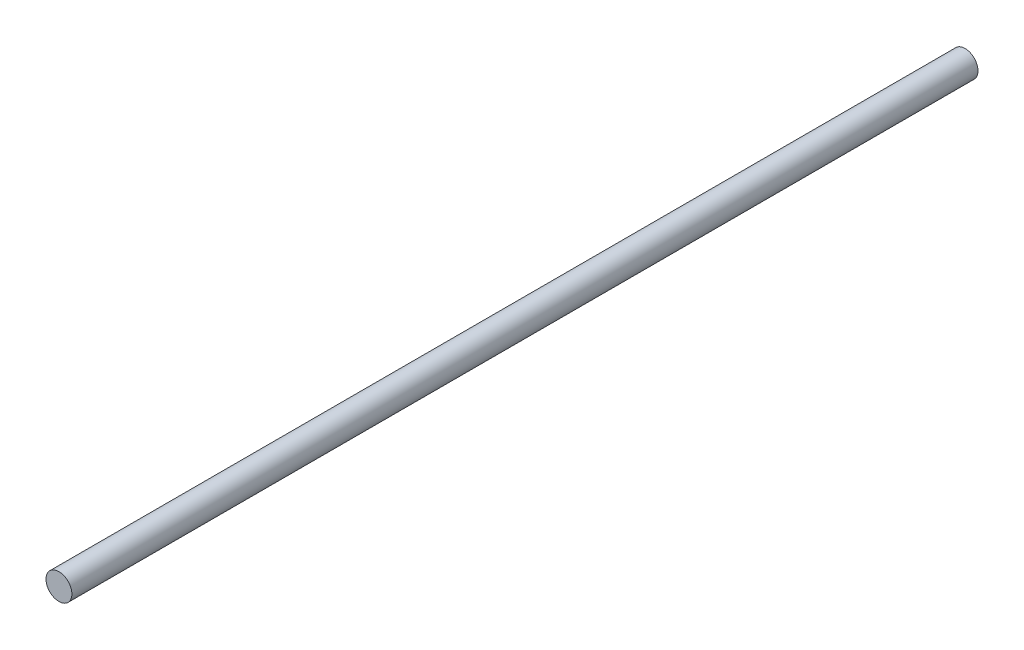
ISO-10303-21;
HEADER;
FILE_DESCRIPTION(('STEP AP214'),'2;1');
FILE_NAME('part.step','',(''),(''),'','','');
FILE_SCHEMA(('AUTOMOTIVE_DESIGN { 1 0 10303 214 1 1 1 1 }'));
ENDSEC;
DATA;
#1=APPLICATION_CONTEXT('core data for automotive mechanical design processes');
#2=APPLICATION_PROTOCOL_DEFINITION('international standard','automotive_design',2000,#1);
#3=PRODUCT_CONTEXT('',#1,'mechanical');
#4=PRODUCT('Part','Part','',(#3));
#5=PRODUCT_RELATED_PRODUCT_CATEGORY('part','',(#4));
#6=PRODUCT_DEFINITION_FORMATION('','',#4);
#7=PRODUCT_DEFINITION_CONTEXT('part definition',#1,'design');
#8=PRODUCT_DEFINITION('design','',#6,#7);
#9=PRODUCT_DEFINITION_SHAPE('','',#8);
#10=(LENGTH_UNIT() NAMED_UNIT(*) SI_UNIT(.MILLI.,.METRE.));
#11=(NAMED_UNIT(*) PLANE_ANGLE_UNIT() SI_UNIT($,.RADIAN.));
#12=(NAMED_UNIT(*) SI_UNIT($,.STERADIAN.) SOLID_ANGLE_UNIT());
#13=UNCERTAINTY_MEASURE_WITH_UNIT(LENGTH_MEASURE(1.E-05),#10,'distance_accuracy_value','');
#14=(GEOMETRIC_REPRESENTATION_CONTEXT(3) GLOBAL_UNCERTAINTY_ASSIGNED_CONTEXT((#13)) GLOBAL_UNIT_ASSIGNED_CONTEXT((#10,
#11,#12)) REPRESENTATION_CONTEXT('',''));
#15=CARTESIAN_POINT('',(0.,0.,0.));
#16=DIRECTION('',(0.,0.,1.));
#17=DIRECTION('',(1.,0.,0.));
#18=AXIS2_PLACEMENT_3D('',#15,#16,#17);
#19=CARTESIAN_POINT('',(0.,0.,0.));
#20=DIRECTION('',(0.,0.,1.));
#21=DIRECTION('',(1.,0.,0.));
#22=AXIS2_PLACEMENT_3D('',#19,#20,#21);
#23=CYLINDRICAL_SURFACE('',#22,4.);
#24=CARTESIAN_POINT('',(0.,0.,0.));
#25=DIRECTION('',(0.,0.,1.));
#26=DIRECTION('',(1.,0.,0.));
#27=AXIS2_PLACEMENT_3D('',#24,#25,#26);
#28=CIRCLE('',#27,4.);
#29=CARTESIAN_POINT('',(4.,0.,0.));
#30=VERTEX_POINT('',#29);
#31=EDGE_CURVE('E10',#30,#30,#28,.T.);
#32=ORIENTED_EDGE('',*,*,#31,.T.);
#33=EDGE_LOOP('',(#32));
#34=FACE_BOUND('',#33,.T.);
#35=CARTESIAN_POINT('',(0.,0.,280.));
#36=DIRECTION('',(0.,0.,1.));
#37=DIRECTION('',(1.,0.,0.));
#38=AXIS2_PLACEMENT_3D('',#35,#36,#37);
#39=CIRCLE('',#38,4.);
#40=CARTESIAN_POINT('',(4.,0.,280.));
#41=VERTEX_POINT('',#40);
#42=EDGE_CURVE('E39',#41,#41,#39,.T.);
#43=ORIENTED_EDGE('',*,*,#42,.F.);
#44=EDGE_LOOP('',(#43));
#45=FACE_BOUND('',#44,.T.);
#46=ADVANCED_FACE('F33',(#34,#45),#23,.T.);
#47=CARTESIAN_POINT('',(4.,0.,0.));
#48=DIRECTION('',(0.,0.,-1.));
#49=DIRECTION('',(-1.,0.,0.));
#50=AXIS2_PLACEMENT_3D('',#47,#48,#49);
#51=PLANE('',#50);
#52=ORIENTED_EDGE('',*,*,#31,.F.);
#53=EDGE_LOOP('',(#52));
#54=FACE_BOUND('',#53,.T.);
#55=ADVANCED_FACE('F48',(#54),#51,.T.);
#56=CARTESIAN_POINT('',(0.,0.,280.));
#57=DIRECTION('',(0.,0.,1.));
#58=DIRECTION('',(1.,0.,0.));
#59=AXIS2_PLACEMENT_3D('',#56,#57,#58);
#60=PLANE('',#59);
#61=ORIENTED_EDGE('',*,*,#42,.T.);
#62=EDGE_LOOP('',(#61));
#63=FACE_BOUND('',#62,.T.);
#64=ADVANCED_FACE('F45',(#63),#60,.T.);
#65=CLOSED_SHELL('',(#46,#55,#64));
#66=MANIFOLD_SOLID_BREP('B2',#65);
#67=ADVANCED_BREP_SHAPE_REPRESENTATION('',(#18,#66),#14);
#68=SHAPE_DEFINITION_REPRESENTATION(#9,#67);
ENDSEC;
END-ISO-10303-21;
